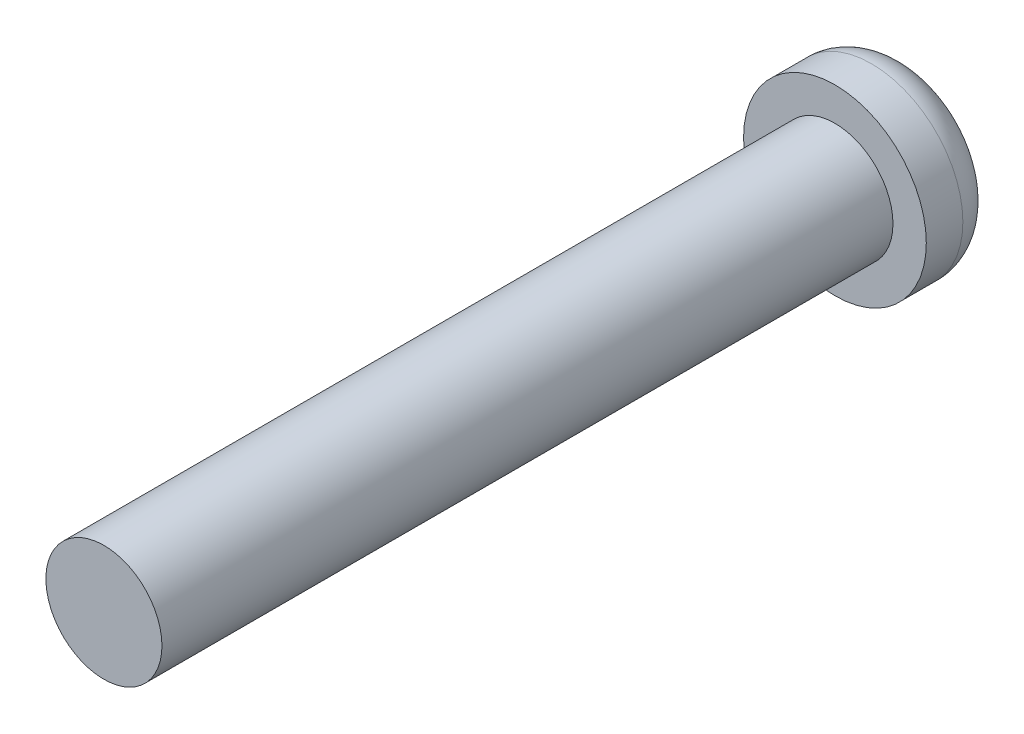
ISO-10303-21;
HEADER;
FILE_DESCRIPTION(('STEP AP214'),'2;1');
FILE_NAME('part.step','',(''),(''),'','','');
FILE_SCHEMA(('AUTOMOTIVE_DESIGN { 1 0 10303 214 1 1 1 1 }'));
ENDSEC;
DATA;
#1=APPLICATION_CONTEXT('core data for automotive mechanical design processes');
#2=APPLICATION_PROTOCOL_DEFINITION('international standard','automotive_design',2000,#1);
#3=PRODUCT_CONTEXT('',#1,'mechanical');
#4=PRODUCT('Part','Part','',(#3));
#5=PRODUCT_RELATED_PRODUCT_CATEGORY('part','',(#4));
#6=PRODUCT_DEFINITION_FORMATION('','',#4);
#7=PRODUCT_DEFINITION_CONTEXT('part definition',#1,'design');
#8=PRODUCT_DEFINITION('design','',#6,#7);
#9=PRODUCT_DEFINITION_SHAPE('','',#8);
#10=(LENGTH_UNIT() NAMED_UNIT(*) SI_UNIT(.MILLI.,.METRE.));
#11=(NAMED_UNIT(*) PLANE_ANGLE_UNIT() SI_UNIT($,.RADIAN.));
#12=(NAMED_UNIT(*) SI_UNIT($,.STERADIAN.) SOLID_ANGLE_UNIT());
#13=UNCERTAINTY_MEASURE_WITH_UNIT(LENGTH_MEASURE(1.E-05),#10,'distance_accuracy_value','');
#14=(GEOMETRIC_REPRESENTATION_CONTEXT(3) GLOBAL_UNCERTAINTY_ASSIGNED_CONTEXT((#13)) GLOBAL_UNIT_ASSIGNED_CONTEXT((#10,
#11,#12)) REPRESENTATION_CONTEXT('',''));
#15=CARTESIAN_POINT('',(0.,0.,0.));
#16=DIRECTION('',(0.,0.,1.));
#17=DIRECTION('',(1.,0.,0.));
#18=AXIS2_PLACEMENT_3D('',#15,#16,#17);
#19=CARTESIAN_POINT('',(0.,0.,20.));
#20=DIRECTION('',(0.,0.,-1.));
#21=DIRECTION('',(-1.,0.,0.));
#22=AXIS2_PLACEMENT_3D('',#19,#20,#21);
#23=CYLINDRICAL_SURFACE('',#22,1.5875);
#24=CARTESIAN_POINT('',(0.,0.,20.));
#25=DIRECTION('',(0.,0.,1.));
#26=DIRECTION('',(1.,0.,0.));
#27=AXIS2_PLACEMENT_3D('',#24,#25,#26);
#28=CIRCLE('',#27,1.5875);
#29=CARTESIAN_POINT('',(1.5875,0.,20.));
#30=VERTEX_POINT('',#29);
#31=EDGE_CURVE('E50',#30,#30,#28,.T.);
#32=ORIENTED_EDGE('',*,*,#31,.F.);
#33=EDGE_LOOP('',(#32));
#34=FACE_BOUND('',#33,.T.);
#35=CARTESIAN_POINT('',(0.,0.,0.));
#36=DIRECTION('',(0.,0.,1.));
#37=DIRECTION('',(1.,0.,0.));
#38=AXIS2_PLACEMENT_3D('',#35,#36,#37);
#39=CIRCLE('',#38,1.5875);
#40=CARTESIAN_POINT('',(1.5875,0.,0.));
#41=VERTEX_POINT('',#40);
#42=EDGE_CURVE('E55',#41,#41,#39,.T.);
#43=ORIENTED_EDGE('',*,*,#42,.T.);
#44=EDGE_LOOP('',(#43));
#45=FACE_BOUND('',#44,.T.);
#46=ADVANCED_FACE('F37',(#34,#45),#23,.T.);
#47=CARTESIAN_POINT('',(0.,0.,20.));
#48=DIRECTION('',(0.,0.,1.));
#49=DIRECTION('',(1.,0.,0.));
#50=AXIS2_PLACEMENT_3D('',#47,#48,#49);
#51=PLANE('',#50);
#52=ORIENTED_EDGE('',*,*,#31,.T.);
#53=EDGE_LOOP('',(#52));
#54=FACE_BOUND('',#53,.T.);
#55=ADVANCED_FACE('F82',(#54),#51,.T.);
#56=CARTESIAN_POINT('',(0.,0.,-2.));
#57=DIRECTION('',(0.,0.,1.));
#58=DIRECTION('',(1.,0.,0.));
#59=AXIS2_PLACEMENT_3D('',#56,#57,#58);
#60=CYLINDRICAL_SURFACE('',#59,2.5);
#61=CARTESIAN_POINT('',(0.,0.,-1.));
#62=DIRECTION('',(0.,0.,-1.));
#63=DIRECTION('',(-1.,0.,0.));
#64=AXIS2_PLACEMENT_3D('',#61,#62,#63);
#65=CIRCLE('',#64,2.5);
#66=CARTESIAN_POINT('',(-2.5,0.,-1.));
#67=VERTEX_POINT('',#66);
#68=EDGE_CURVE('E10',#67,#67,#65,.F.);
#69=ORIENTED_EDGE('',*,*,#68,.T.);
#70=EDGE_LOOP('',(#69));
#71=FACE_BOUND('',#70,.T.);
#72=CARTESIAN_POINT('',(0.,0.,0.));
#73=DIRECTION('',(0.,0.,-1.));
#74=DIRECTION('',(-1.,0.,0.));
#75=AXIS2_PLACEMENT_3D('',#72,#73,#74);
#76=CIRCLE('',#75,2.5);
#77=CARTESIAN_POINT('',(-2.5,0.,0.));
#78=VERTEX_POINT('',#77);
#79=EDGE_CURVE('E60',#78,#78,#76,.T.);
#80=ORIENTED_EDGE('',*,*,#79,.T.);
#81=EDGE_LOOP('',(#80));
#82=FACE_BOUND('',#81,.T.);
#83=ADVANCED_FACE('F66',(#71,#82),#60,.T.);
#84=CARTESIAN_POINT('',(0.,0.,-2.));
#85=DIRECTION('',(0.,0.,-1.));
#86=DIRECTION('',(-1.,0.,0.));
#87=AXIS2_PLACEMENT_3D('',#84,#85,#86);
#88=PLANE('',#87);
#89=CARTESIAN_POINT('',(0.,0.,-2.));
#90=DIRECTION('',(0.,0.,-1.));
#91=DIRECTION('',(-1.,0.,0.));
#92=AXIS2_PLACEMENT_3D('',#89,#90,#91);
#93=CIRCLE('',#92,1.5);
#94=CARTESIAN_POINT('',(-1.5,0.,-2.));
#95=VERTEX_POINT('',#94);
#96=EDGE_CURVE('E45',#95,#95,#93,.T.);
#97=ORIENTED_EDGE('',*,*,#96,.T.);
#98=EDGE_LOOP('',(#97));
#99=FACE_BOUND('',#98,.T.);
#100=ADVANCED_FACE('F70',(#99),#88,.T.);
#101=CARTESIAN_POINT('',(0.,0.,0.));
#102=DIRECTION('',(0.,0.,-1.));
#103=DIRECTION('',(-1.,0.,0.));
#104=AXIS2_PLACEMENT_3D('',#101,#102,#103);
#105=PLANE('',#104);
#106=ORIENTED_EDGE('',*,*,#42,.F.);
#107=EDGE_LOOP('',(#106));
#108=FACE_BOUND('',#107,.T.);
#109=ORIENTED_EDGE('',*,*,#79,.F.);
#110=EDGE_LOOP('',(#109));
#111=FACE_BOUND('',#110,.T.);
#112=ADVANCED_FACE('F68',(#108,#111),#105,.F.);
#113=CARTESIAN_POINT('',(0.,0.,-1.));
#114=DIRECTION('',(0.,0.,-1.));
#115=DIRECTION('',(-1.,0.,0.));
#116=AXIS2_PLACEMENT_3D('',#113,#114,#115);
#117=TOROIDAL_SURFACE('',#116,1.5,1.);
#118=ORIENTED_EDGE('',*,*,#68,.F.);
#119=EDGE_LOOP('',(#118));
#120=FACE_BOUND('',#119,.T.);
#121=ORIENTED_EDGE('',*,*,#96,.F.);
#122=EDGE_LOOP('',(#121));
#123=FACE_BOUND('',#122,.T.);
#124=ADVANCED_FACE('F39',(#120,#123),#117,.T.);
#125=CLOSED_SHELL('',(#46,#55,#83,#100,#112,#124));
#126=MANIFOLD_SOLID_BREP('B2',#125);
#127=ADVANCED_BREP_SHAPE_REPRESENTATION('',(#18,#126),#14);
#128=SHAPE_DEFINITION_REPRESENTATION(#9,#127);
ENDSEC;
END-ISO-10303-21;
